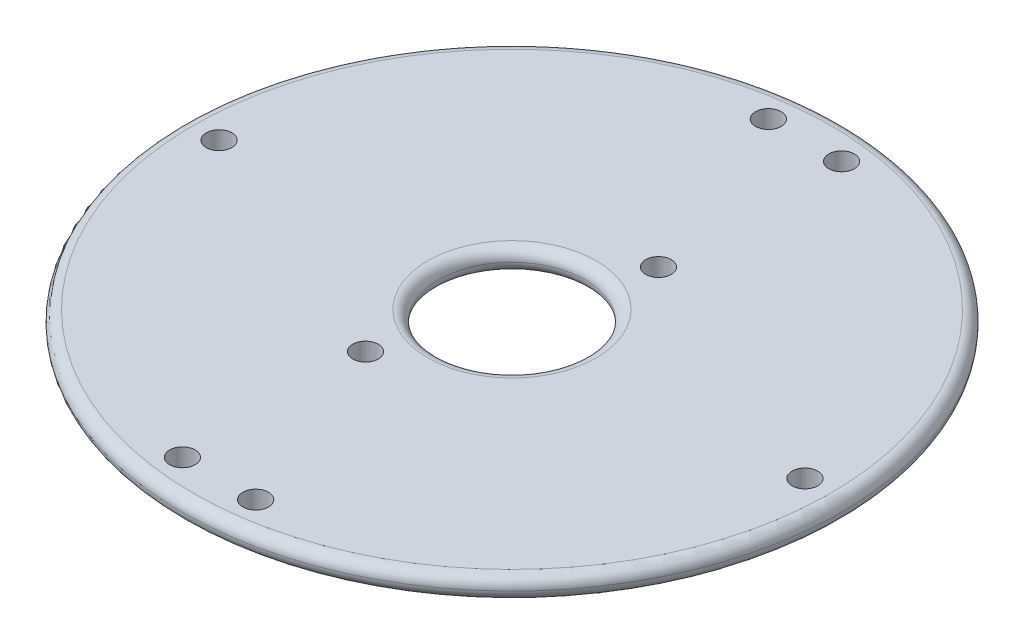
ISO-10303-21;
HEADER;
FILE_DESCRIPTION(('STEP AP214'),'2;1');
FILE_NAME('part.step','',(''),(''),'','','');
FILE_SCHEMA(('AUTOMOTIVE_DESIGN { 1 0 10303 214 1 1 1 1 }'));
ENDSEC;
DATA;
#1=APPLICATION_CONTEXT('core data for automotive mechanical design processes');
#2=APPLICATION_PROTOCOL_DEFINITION('international standard','automotive_design',2000,#1);
#3=PRODUCT_CONTEXT('',#1,'mechanical');
#4=PRODUCT('Part','Part','',(#3));
#5=PRODUCT_RELATED_PRODUCT_CATEGORY('part','',(#4));
#6=PRODUCT_DEFINITION_FORMATION('','',#4);
#7=PRODUCT_DEFINITION_CONTEXT('part definition',#1,'design');
#8=PRODUCT_DEFINITION('design','',#6,#7);
#9=PRODUCT_DEFINITION_SHAPE('','',#8);
#10=(LENGTH_UNIT() NAMED_UNIT(*) SI_UNIT(.MILLI.,.METRE.));
#11=(NAMED_UNIT(*) PLANE_ANGLE_UNIT() SI_UNIT($,.RADIAN.));
#12=(NAMED_UNIT(*) SI_UNIT($,.STERADIAN.) SOLID_ANGLE_UNIT());
#13=UNCERTAINTY_MEASURE_WITH_UNIT(LENGTH_MEASURE(1.E-05),#10,'distance_accuracy_value','');
#14=(GEOMETRIC_REPRESENTATION_CONTEXT(3) GLOBAL_UNCERTAINTY_ASSIGNED_CONTEXT((#13)) GLOBAL_UNIT_ASSIGNED_CONTEXT((#10,
#11,#12)) REPRESENTATION_CONTEXT('',''));
#15=CARTESIAN_POINT('',(0.,0.,0.));
#16=DIRECTION('',(0.,0.,1.));
#17=DIRECTION('',(1.,0.,0.));
#18=AXIS2_PLACEMENT_3D('',#15,#16,#17);
#19=CARTESIAN_POINT('',(0.,3.,0.));
#20=DIRECTION('',(0.,1.,0.));
#21=DIRECTION('',(0.,0.,1.));
#22=AXIS2_PLACEMENT_3D('',#19,#20,#21);
#23=PLANE('',#22);
#24=CARTESIAN_POINT('',(0.,3.,0.));
#25=DIRECTION('',(0.,1.,0.));
#26=DIRECTION('',(0.,0.,1.));
#27=AXIS2_PLACEMENT_3D('',#24,#25,#26);
#28=CIRCLE('',#27,11.5);
#29=CARTESIAN_POINT('',(0.,3.,11.5));
#30=VERTEX_POINT('',#29);
#31=EDGE_CURVE('E10',#30,#30,#28,.F.);
#32=ORIENTED_EDGE('',*,*,#31,.T.);
#33=EDGE_LOOP('',(#32));
#34=FACE_BOUND('',#33,.T.);
#35=CARTESIAN_POINT('',(0.,3.,0.));
#36=DIRECTION('',(0.,1.,0.));
#37=DIRECTION('',(0.,0.,1.));
#38=AXIS2_PLACEMENT_3D('',#35,#36,#37);
#39=CIRCLE('',#38,43.5);
#40=CARTESIAN_POINT('',(0.,3.,43.5));
#41=VERTEX_POINT('',#40);
#42=EDGE_CURVE('E50',#41,#41,#39,.T.);
#43=ORIENTED_EDGE('',*,*,#42,.T.);
#44=EDGE_LOOP('',(#43));
#45=FACE_BOUND('',#44,.T.);
#46=CARTESIAN_POINT('',(5.,3.,-15.));
#47=DIRECTION('',(0.,1.,0.));
#48=DIRECTION('',(0.,0.,1.));
#49=AXIS2_PLACEMENT_3D('',#46,#47,#48);
#50=CIRCLE('',#49,1.75);
#51=CARTESIAN_POINT('',(5.,3.,-13.25));
#52=VERTEX_POINT('',#51);
#53=EDGE_CURVE('E110',#52,#52,#50,.T.);
#54=ORIENTED_EDGE('',*,*,#53,.F.);
#55=EDGE_LOOP('',(#54));
#56=FACE_BOUND('',#55,.T.);
#57=CARTESIAN_POINT('',(-5.,3.,15.));
#58=DIRECTION('',(0.,1.,0.));
#59=DIRECTION('',(0.,0.,1.));
#60=AXIS2_PLACEMENT_3D('',#57,#58,#59);
#61=CIRCLE('',#60,1.75);
#62=CARTESIAN_POINT('',(-5.,3.,16.75));
#63=VERTEX_POINT('',#62);
#64=EDGE_CURVE('E106',#63,#63,#61,.T.);
#65=ORIENTED_EDGE('',*,*,#64,.F.);
#66=EDGE_LOOP('',(#65));
#67=FACE_BOUND('',#66,.T.);
#68=CARTESIAN_POINT('',(-40.,3.,0.));
#69=DIRECTION('',(0.,1.,0.));
#70=DIRECTION('',(0.,0.,1.));
#71=AXIS2_PLACEMENT_3D('',#68,#69,#70);
#72=CIRCLE('',#71,1.75);
#73=CARTESIAN_POINT('',(-40.,3.,1.75000000000001));
#74=VERTEX_POINT('',#73);
#75=EDGE_CURVE('E102',#74,#74,#72,.T.);
#76=ORIENTED_EDGE('',*,*,#75,.F.);
#77=EDGE_LOOP('',(#76));
#78=FACE_BOUND('',#77,.T.);
#79=CARTESIAN_POINT('',(5.,3.,-40.));
#80=DIRECTION('',(0.,1.,0.));
#81=DIRECTION('',(0.,0.,1.));
#82=AXIS2_PLACEMENT_3D('',#79,#80,#81);
#83=CIRCLE('',#82,1.75);
#84=CARTESIAN_POINT('',(5.,3.,-38.25));
#85=VERTEX_POINT('',#84);
#86=EDGE_CURVE('E101',#85,#85,#83,.T.);
#87=ORIENTED_EDGE('',*,*,#86,.F.);
#88=EDGE_LOOP('',(#87));
#89=FACE_BOUND('',#88,.T.);
#90=CARTESIAN_POINT('',(5.,3.,40.));
#91=DIRECTION('',(0.,1.,0.));
#92=DIRECTION('',(0.,0.,1.));
#93=AXIS2_PLACEMENT_3D('',#90,#91,#92);
#94=CIRCLE('',#93,1.75);
#95=CARTESIAN_POINT('',(5.,3.,41.75));
#96=VERTEX_POINT('',#95);
#97=EDGE_CURVE('E57',#96,#96,#94,.T.);
#98=ORIENTED_EDGE('',*,*,#97,.F.);
#99=EDGE_LOOP('',(#98));
#100=FACE_BOUND('',#99,.T.);
#101=CARTESIAN_POINT('',(-5.,3.,40.));
#102=DIRECTION('',(0.,1.,0.));
#103=DIRECTION('',(0.,0.,1.));
#104=AXIS2_PLACEMENT_3D('',#101,#102,#103);
#105=CIRCLE('',#104,1.75);
#106=CARTESIAN_POINT('',(-5.,3.,41.75));
#107=VERTEX_POINT('',#106);
#108=EDGE_CURVE('E118',#107,#107,#105,.T.);
#109=ORIENTED_EDGE('',*,*,#108,.F.);
#110=EDGE_LOOP('',(#109));
#111=FACE_BOUND('',#110,.T.);
#112=CARTESIAN_POINT('',(40.,3.,0.));
#113=DIRECTION('',(0.,1.,0.));
#114=DIRECTION('',(0.,0.,1.));
#115=AXIS2_PLACEMENT_3D('',#112,#113,#114);
#116=CIRCLE('',#115,1.75);
#117=CARTESIAN_POINT('',(40.,3.,1.75));
#118=VERTEX_POINT('',#117);
#119=EDGE_CURVE('E114',#118,#118,#116,.T.);
#120=ORIENTED_EDGE('',*,*,#119,.F.);
#121=EDGE_LOOP('',(#120));
#122=FACE_BOUND('',#121,.T.);
#123=CARTESIAN_POINT('',(-5.,3.,-40.));
#124=DIRECTION('',(0.,1.,0.));
#125=DIRECTION('',(0.,0.,1.));
#126=AXIS2_PLACEMENT_3D('',#123,#124,#125);
#127=CIRCLE('',#126,1.75);
#128=CARTESIAN_POINT('',(-5.,3.,-38.25));
#129=VERTEX_POINT('',#128);
#130=EDGE_CURVE('E97',#129,#129,#127,.T.);
#131=ORIENTED_EDGE('',*,*,#130,.F.);
#132=EDGE_LOOP('',(#131));
#133=FACE_BOUND('',#132,.T.);
#134=ADVANCED_FACE('F36',(#34,#45,#56,#67,#78,#89,#100,#111,#122,#133),#23,.T.);
#135=CARTESIAN_POINT('',(0.,0.,0.));
#136=DIRECTION('',(0.,1.,0.));
#137=DIRECTION('',(0.,0.,1.));
#138=AXIS2_PLACEMENT_3D('',#135,#136,#137);
#139=PLANE('',#138);
#140=CARTESIAN_POINT('',(0.,0.,0.));
#141=DIRECTION('',(0.,1.,0.));
#142=DIRECTION('',(0.,0.,1.));
#143=AXIS2_PLACEMENT_3D('',#140,#141,#142);
#144=CIRCLE('',#143,11.5);
#145=CARTESIAN_POINT('',(0.,0.,11.5));
#146=VERTEX_POINT('',#145);
#147=EDGE_CURVE('E45',#146,#146,#144,.T.);
#148=ORIENTED_EDGE('',*,*,#147,.T.);
#149=EDGE_LOOP('',(#148));
#150=FACE_BOUND('',#149,.T.);
#151=CARTESIAN_POINT('',(0.,0.,0.));
#152=DIRECTION('',(0.,1.,0.));
#153=DIRECTION('',(0.,0.,1.));
#154=AXIS2_PLACEMENT_3D('',#151,#152,#153);
#155=CIRCLE('',#154,43.5);
#156=CARTESIAN_POINT('',(0.,0.,43.5));
#157=VERTEX_POINT('',#156);
#158=EDGE_CURVE('E61',#157,#157,#155,.F.);
#159=ORIENTED_EDGE('',*,*,#158,.T.);
#160=EDGE_LOOP('',(#159));
#161=FACE_BOUND('',#160,.T.);
#162=CARTESIAN_POINT('',(5.,0.,-15.));
#163=DIRECTION('',(0.,1.,0.));
#164=DIRECTION('',(0.,0.,1.));
#165=AXIS2_PLACEMENT_3D('',#162,#163,#164);
#166=CIRCLE('',#165,1.75);
#167=CARTESIAN_POINT('',(5.,0.,-13.25));
#168=VERTEX_POINT('',#167);
#169=EDGE_CURVE('E65',#168,#168,#166,.T.);
#170=ORIENTED_EDGE('',*,*,#169,.T.);
#171=EDGE_LOOP('',(#170));
#172=FACE_BOUND('',#171,.T.);
#173=CARTESIAN_POINT('',(-5.,0.,15.));
#174=DIRECTION('',(0.,1.,0.));
#175=DIRECTION('',(0.,0.,1.));
#176=AXIS2_PLACEMENT_3D('',#173,#174,#175);
#177=CIRCLE('',#176,1.75);
#178=CARTESIAN_POINT('',(-5.,0.,16.75));
#179=VERTEX_POINT('',#178);
#180=EDGE_CURVE('E69',#179,#179,#177,.T.);
#181=ORIENTED_EDGE('',*,*,#180,.T.);
#182=EDGE_LOOP('',(#181));
#183=FACE_BOUND('',#182,.T.);
#184=CARTESIAN_POINT('',(-40.,0.,0.));
#185=DIRECTION('',(0.,1.,0.));
#186=DIRECTION('',(0.,0.,1.));
#187=AXIS2_PLACEMENT_3D('',#184,#185,#186);
#188=CIRCLE('',#187,1.75);
#189=CARTESIAN_POINT('',(-40.,0.,1.75000000000001));
#190=VERTEX_POINT('',#189);
#191=EDGE_CURVE('E73',#190,#190,#188,.T.);
#192=ORIENTED_EDGE('',*,*,#191,.T.);
#193=EDGE_LOOP('',(#192));
#194=FACE_BOUND('',#193,.T.);
#195=CARTESIAN_POINT('',(5.,0.,-40.));
#196=DIRECTION('',(0.,1.,0.));
#197=DIRECTION('',(0.,0.,1.));
#198=AXIS2_PLACEMENT_3D('',#195,#196,#197);
#199=CIRCLE('',#198,1.75);
#200=CARTESIAN_POINT('',(5.,0.,-38.25));
#201=VERTEX_POINT('',#200);
#202=EDGE_CURVE('E77',#201,#201,#199,.T.);
#203=ORIENTED_EDGE('',*,*,#202,.T.);
#204=EDGE_LOOP('',(#203));
#205=FACE_BOUND('',#204,.T.);
#206=CARTESIAN_POINT('',(5.,0.,40.));
#207=DIRECTION('',(0.,1.,0.));
#208=DIRECTION('',(0.,0.,1.));
#209=AXIS2_PLACEMENT_3D('',#206,#207,#208);
#210=CIRCLE('',#209,1.75);
#211=CARTESIAN_POINT('',(5.,0.,41.75));
#212=VERTEX_POINT('',#211);
#213=EDGE_CURVE('E81',#212,#212,#210,.T.);
#214=ORIENTED_EDGE('',*,*,#213,.T.);
#215=EDGE_LOOP('',(#214));
#216=FACE_BOUND('',#215,.T.);
#217=CARTESIAN_POINT('',(-5.,0.,40.));
#218=DIRECTION('',(0.,1.,0.));
#219=DIRECTION('',(0.,0.,1.));
#220=AXIS2_PLACEMENT_3D('',#217,#218,#219);
#221=CIRCLE('',#220,1.75);
#222=CARTESIAN_POINT('',(-5.,0.,41.75));
#223=VERTEX_POINT('',#222);
#224=EDGE_CURVE('E85',#223,#223,#221,.T.);
#225=ORIENTED_EDGE('',*,*,#224,.T.);
#226=EDGE_LOOP('',(#225));
#227=FACE_BOUND('',#226,.T.);
#228=CARTESIAN_POINT('',(40.,0.,0.));
#229=DIRECTION('',(0.,1.,0.));
#230=DIRECTION('',(0.,0.,1.));
#231=AXIS2_PLACEMENT_3D('',#228,#229,#230);
#232=CIRCLE('',#231,1.75);
#233=CARTESIAN_POINT('',(40.,0.,1.75));
#234=VERTEX_POINT('',#233);
#235=EDGE_CURVE('E89',#234,#234,#232,.T.);
#236=ORIENTED_EDGE('',*,*,#235,.T.);
#237=EDGE_LOOP('',(#236));
#238=FACE_BOUND('',#237,.T.);
#239=CARTESIAN_POINT('',(-5.,0.,-40.));
#240=DIRECTION('',(0.,1.,0.));
#241=DIRECTION('',(0.,0.,1.));
#242=AXIS2_PLACEMENT_3D('',#239,#240,#241);
#243=CIRCLE('',#242,1.75);
#244=CARTESIAN_POINT('',(-5.,0.,-38.25));
#245=VERTEX_POINT('',#244);
#246=EDGE_CURVE('E93',#245,#245,#243,.T.);
#247=ORIENTED_EDGE('',*,*,#246,.T.);
#248=EDGE_LOOP('',(#247));
#249=FACE_BOUND('',#248,.T.);
#250=ADVANCED_FACE('F134',(#150,#161,#172,#183,#194,#205,#216,#227,#238,#249),#139,.F.);
#251=CARTESIAN_POINT('',(-5.,-7.,-40.));
#252=DIRECTION('',(0.,1.,0.));
#253=DIRECTION('',(0.,0.,1.));
#254=AXIS2_PLACEMENT_3D('',#251,#252,#253);
#255=CYLINDRICAL_SURFACE('',#254,1.75);
#256=ORIENTED_EDGE('',*,*,#130,.T.);
#257=EDGE_LOOP('',(#256));
#258=FACE_BOUND('',#257,.T.);
#259=ORIENTED_EDGE('',*,*,#246,.F.);
#260=EDGE_LOOP('',(#259));
#261=FACE_BOUND('',#260,.T.);
#262=ADVANCED_FACE('F142',(#258,#261),#255,.F.);
#263=CARTESIAN_POINT('',(40.,-7.,0.));
#264=DIRECTION('',(0.,1.,0.));
#265=DIRECTION('',(0.,0.,1.));
#266=AXIS2_PLACEMENT_3D('',#263,#264,#265);
#267=CYLINDRICAL_SURFACE('',#266,1.75);
#268=ORIENTED_EDGE('',*,*,#119,.T.);
#269=EDGE_LOOP('',(#268));
#270=FACE_BOUND('',#269,.T.);
#271=ORIENTED_EDGE('',*,*,#235,.F.);
#272=EDGE_LOOP('',(#271));
#273=FACE_BOUND('',#272,.T.);
#274=ADVANCED_FACE('F145',(#270,#273),#267,.F.);
#275=CARTESIAN_POINT('',(-5.,-7.,40.));
#276=DIRECTION('',(0.,1.,0.));
#277=DIRECTION('',(0.,0.,1.));
#278=AXIS2_PLACEMENT_3D('',#275,#276,#277);
#279=CYLINDRICAL_SURFACE('',#278,1.75);
#280=ORIENTED_EDGE('',*,*,#108,.T.);
#281=EDGE_LOOP('',(#280));
#282=FACE_BOUND('',#281,.T.);
#283=ORIENTED_EDGE('',*,*,#224,.F.);
#284=EDGE_LOOP('',(#283));
#285=FACE_BOUND('',#284,.T.);
#286=ADVANCED_FACE('F224',(#282,#285),#279,.F.);
#287=CARTESIAN_POINT('',(5.,-7.,40.));
#288=DIRECTION('',(0.,1.,0.));
#289=DIRECTION('',(0.,0.,1.));
#290=AXIS2_PLACEMENT_3D('',#287,#288,#289);
#291=CYLINDRICAL_SURFACE('',#290,1.75);
#292=ORIENTED_EDGE('',*,*,#97,.T.);
#293=EDGE_LOOP('',(#292));
#294=FACE_BOUND('',#293,.T.);
#295=ORIENTED_EDGE('',*,*,#213,.F.);
#296=EDGE_LOOP('',(#295));
#297=FACE_BOUND('',#296,.T.);
#298=ADVANCED_FACE('F129',(#294,#297),#291,.F.);
#299=CARTESIAN_POINT('',(5.,-7.,-40.));
#300=DIRECTION('',(0.,1.,0.));
#301=DIRECTION('',(0.,0.,1.));
#302=AXIS2_PLACEMENT_3D('',#299,#300,#301);
#303=CYLINDRICAL_SURFACE('',#302,1.75);
#304=ORIENTED_EDGE('',*,*,#86,.T.);
#305=EDGE_LOOP('',(#304));
#306=FACE_BOUND('',#305,.T.);
#307=ORIENTED_EDGE('',*,*,#202,.F.);
#308=EDGE_LOOP('',(#307));
#309=FACE_BOUND('',#308,.T.);
#310=ADVANCED_FACE('F209',(#306,#309),#303,.F.);
#311=CARTESIAN_POINT('',(-40.,-7.,0.));
#312=DIRECTION('',(0.,1.,0.));
#313=DIRECTION('',(0.,0.,1.));
#314=AXIS2_PLACEMENT_3D('',#311,#312,#313);
#315=CYLINDRICAL_SURFACE('',#314,1.75);
#316=ORIENTED_EDGE('',*,*,#75,.T.);
#317=EDGE_LOOP('',(#316));
#318=FACE_BOUND('',#317,.T.);
#319=ORIENTED_EDGE('',*,*,#191,.F.);
#320=EDGE_LOOP('',(#319));
#321=FACE_BOUND('',#320,.T.);
#322=ADVANCED_FACE('F201',(#318,#321),#315,.F.);
#323=CARTESIAN_POINT('',(-5.,-7.,15.));
#324=DIRECTION('',(0.,1.,0.));
#325=DIRECTION('',(0.,0.,1.));
#326=AXIS2_PLACEMENT_3D('',#323,#324,#325);
#327=CYLINDRICAL_SURFACE('',#326,1.75);
#328=ORIENTED_EDGE('',*,*,#64,.T.);
#329=EDGE_LOOP('',(#328));
#330=FACE_BOUND('',#329,.T.);
#331=ORIENTED_EDGE('',*,*,#180,.F.);
#332=EDGE_LOOP('',(#331));
#333=FACE_BOUND('',#332,.T.);
#334=ADVANCED_FACE('F193',(#330,#333),#327,.F.);
#335=CARTESIAN_POINT('',(5.,-7.,-15.));
#336=DIRECTION('',(0.,1.,0.));
#337=DIRECTION('',(0.,0.,1.));
#338=AXIS2_PLACEMENT_3D('',#335,#336,#337);
#339=CYLINDRICAL_SURFACE('',#338,1.75);
#340=ORIENTED_EDGE('',*,*,#53,.T.);
#341=EDGE_LOOP('',(#340));
#342=FACE_BOUND('',#341,.T.);
#343=ORIENTED_EDGE('',*,*,#169,.F.);
#344=EDGE_LOOP('',(#343));
#345=FACE_BOUND('',#344,.T.);
#346=ADVANCED_FACE('F163',(#342,#345),#339,.F.);
#347=CARTESIAN_POINT('',(0.,1.5,0.));
#348=DIRECTION('',(0.,1.,0.));
#349=DIRECTION('',(0.,0.,1.));
#350=AXIS2_PLACEMENT_3D('',#347,#348,#349);
#351=TOROIDAL_SURFACE('',#350,43.5,1.5);
#352=ORIENTED_EDGE('',*,*,#42,.F.);
#353=EDGE_LOOP('',(#352));
#354=FACE_BOUND('',#353,.T.);
#355=CARTESIAN_POINT('',(0.,1.5,0.));
#356=DIRECTION('',(0.,1.,0.));
#357=DIRECTION('',(0.,0.,1.));
#358=AXIS2_PLACEMENT_3D('',#355,#356,#357);
#359=CIRCLE('',#358,45.);
#360=CARTESIAN_POINT('',(0.,1.5,45.));
#361=VERTEX_POINT('',#360);
#362=EDGE_CURVE('E53',#361,#361,#359,.F.);
#363=ORIENTED_EDGE('',*,*,#362,.F.);
#364=EDGE_LOOP('',(#363));
#365=FACE_BOUND('',#364,.T.);
#366=ADVANCED_FACE('F160',(#354,#365),#351,.T.);
#367=CARTESIAN_POINT('',(0.,1.5,0.));
#368=DIRECTION('',(0.,1.,0.));
#369=DIRECTION('',(0.,0.,1.));
#370=AXIS2_PLACEMENT_3D('',#367,#368,#369);
#371=TOROIDAL_SURFACE('',#370,43.5,1.5);
#372=ORIENTED_EDGE('',*,*,#158,.F.);
#373=EDGE_LOOP('',(#372));
#374=FACE_BOUND('',#373,.T.);
#375=ORIENTED_EDGE('',*,*,#362,.T.);
#376=EDGE_LOOP('',(#375));
#377=FACE_BOUND('',#376,.T.);
#378=ADVANCED_FACE('F157',(#374,#377),#371,.T.);
#379=CARTESIAN_POINT('',(0.,1.5,0.));
#380=DIRECTION('',(0.,1.,0.));
#381=DIRECTION('',(0.,0.,1.));
#382=AXIS2_PLACEMENT_3D('',#379,#380,#381);
#383=TOROIDAL_SURFACE('',#382,11.5,1.5);
#384=ORIENTED_EDGE('',*,*,#31,.F.);
#385=EDGE_LOOP('',(#384));
#386=FACE_BOUND('',#385,.T.);
#387=CARTESIAN_POINT('',(0.,1.5,0.));
#388=DIRECTION('',(0.,1.,0.));
#389=DIRECTION('',(0.,0.,1.));
#390=AXIS2_PLACEMENT_3D('',#387,#388,#389);
#391=CIRCLE('',#390,10.);
#392=CARTESIAN_POINT('',(0.,1.5,10.));
#393=VERTEX_POINT('',#392);
#394=EDGE_CURVE('E40',#393,#393,#391,.T.);
#395=ORIENTED_EDGE('',*,*,#394,.F.);
#396=EDGE_LOOP('',(#395));
#397=FACE_BOUND('',#396,.T.);
#398=ADVANCED_FACE('F38',(#386,#397),#383,.T.);
#399=CARTESIAN_POINT('',(0.,1.5,0.));
#400=DIRECTION('',(0.,1.,0.));
#401=DIRECTION('',(0.,0.,1.));
#402=AXIS2_PLACEMENT_3D('',#399,#400,#401);
#403=TOROIDAL_SURFACE('',#402,11.5,1.5);
#404=ORIENTED_EDGE('',*,*,#394,.T.);
#405=EDGE_LOOP('',(#404));
#406=FACE_BOUND('',#405,.T.);
#407=ORIENTED_EDGE('',*,*,#147,.F.);
#408=EDGE_LOOP('',(#407));
#409=FACE_BOUND('',#408,.T.);
#410=ADVANCED_FACE('F165',(#406,#409),#403,.T.);
#411=CLOSED_SHELL('',(#134,#250,#262,#274,#286,#298,#310,#322,#334,#346,#366,#378,#398,#410));
#412=MANIFOLD_SOLID_BREP('B2',#411);
#413=ADVANCED_BREP_SHAPE_REPRESENTATION('',(#18,#412),#14);
#414=SHAPE_DEFINITION_REPRESENTATION(#9,#413);
ENDSEC;
END-ISO-10303-21;
